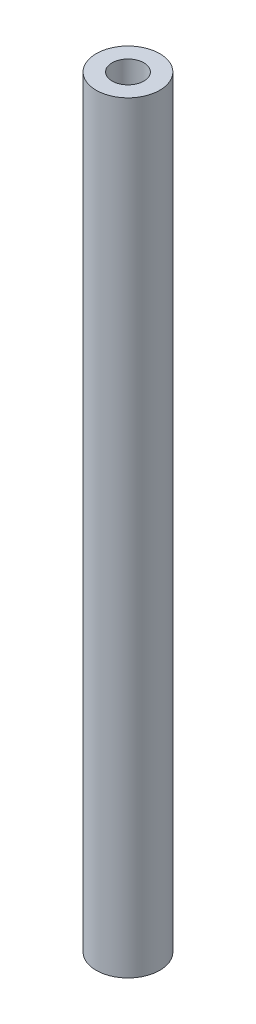
ISO-10303-21;
HEADER;
FILE_DESCRIPTION(('STEP AP214'),'2;1');
FILE_NAME('part.step','',(''),(''),'','','');
FILE_SCHEMA(('AUTOMOTIVE_DESIGN { 1 0 10303 214 1 1 1 1 }'));
ENDSEC;
DATA;
#1=APPLICATION_CONTEXT('core data for automotive mechanical design processes');
#2=APPLICATION_PROTOCOL_DEFINITION('international standard','automotive_design',2000,#1);
#3=PRODUCT_CONTEXT('',#1,'mechanical');
#4=PRODUCT('Part','Part','',(#3));
#5=PRODUCT_RELATED_PRODUCT_CATEGORY('part','',(#4));
#6=PRODUCT_DEFINITION_FORMATION('','',#4);
#7=PRODUCT_DEFINITION_CONTEXT('part definition',#1,'design');
#8=PRODUCT_DEFINITION('design','',#6,#7);
#9=PRODUCT_DEFINITION_SHAPE('','',#8);
#10=(LENGTH_UNIT() NAMED_UNIT(*) SI_UNIT(.MILLI.,.METRE.));
#11=(NAMED_UNIT(*) PLANE_ANGLE_UNIT() SI_UNIT($,.RADIAN.));
#12=(NAMED_UNIT(*) SI_UNIT($,.STERADIAN.) SOLID_ANGLE_UNIT());
#13=UNCERTAINTY_MEASURE_WITH_UNIT(LENGTH_MEASURE(1.E-05),#10,'distance_accuracy_value','');
#14=(GEOMETRIC_REPRESENTATION_CONTEXT(3) GLOBAL_UNCERTAINTY_ASSIGNED_CONTEXT((#13)) GLOBAL_UNIT_ASSIGNED_CONTEXT((#10,
#11,#12)) REPRESENTATION_CONTEXT('',''));
#15=CARTESIAN_POINT('',(0.,0.,0.));
#16=DIRECTION('',(0.,0.,1.));
#17=DIRECTION('',(1.,0.,0.));
#18=AXIS2_PLACEMENT_3D('',#15,#16,#17);
#19=CARTESIAN_POINT('',(0.,60.,0.));
#20=DIRECTION('',(0.,-1.,0.));
#21=DIRECTION('',(0.,0.,-1.));
#22=AXIS2_PLACEMENT_3D('',#19,#20,#21);
#23=CYLINDRICAL_SURFACE('',#22,2.5);
#24=CARTESIAN_POINT('',(0.,60.,0.));
#25=DIRECTION('',(0.,1.,0.));
#26=DIRECTION('',(0.,0.,1.));
#27=AXIS2_PLACEMENT_3D('',#24,#25,#26);
#28=CIRCLE('',#27,2.5);
#29=CARTESIAN_POINT('',(0.,60.,2.5));
#30=VERTEX_POINT('',#29);
#31=EDGE_CURVE('E10',#30,#30,#28,.T.);
#32=ORIENTED_EDGE('',*,*,#31,.F.);
#33=EDGE_LOOP('',(#32));
#34=FACE_BOUND('',#33,.T.);
#35=CARTESIAN_POINT('',(0.,0.,0.));
#36=DIRECTION('',(0.,1.,0.));
#37=DIRECTION('',(0.,0.,1.));
#38=AXIS2_PLACEMENT_3D('',#35,#36,#37);
#39=CIRCLE('',#38,2.5);
#40=CARTESIAN_POINT('',(0.,0.,2.5));
#41=VERTEX_POINT('',#40);
#42=EDGE_CURVE('E33',#41,#41,#39,.T.);
#43=ORIENTED_EDGE('',*,*,#42,.T.);
#44=EDGE_LOOP('',(#43));
#45=FACE_BOUND('',#44,.T.);
#46=ADVANCED_FACE('F30',(#34,#45),#23,.T.);
#47=CARTESIAN_POINT('',(0.,60.,0.));
#48=DIRECTION('',(0.,1.,0.));
#49=DIRECTION('',(0.,0.,1.));
#50=AXIS2_PLACEMENT_3D('',#47,#48,#49);
#51=PLANE('',#50);
#52=CARTESIAN_POINT('',(0.,60.,0.));
#53=DIRECTION('',(0.,1.,0.));
#54=DIRECTION('',(0.,0.,1.));
#55=AXIS2_PLACEMENT_3D('',#52,#53,#54);
#56=CIRCLE('',#55,1.25);
#57=CARTESIAN_POINT('',(0.,60.,1.25));
#58=VERTEX_POINT('',#57);
#59=EDGE_CURVE('E42',#58,#58,#56,.T.);
#60=ORIENTED_EDGE('',*,*,#59,.F.);
#61=EDGE_LOOP('',(#60));
#62=FACE_BOUND('',#61,.T.);
#63=ORIENTED_EDGE('',*,*,#31,.T.);
#64=EDGE_LOOP('',(#63));
#65=FACE_BOUND('',#64,.T.);
#66=ADVANCED_FACE('F57',(#62,#65),#51,.T.);
#67=CARTESIAN_POINT('',(0.,0.,0.));
#68=DIRECTION('',(0.,1.,0.));
#69=DIRECTION('',(0.,0.,1.));
#70=AXIS2_PLACEMENT_3D('',#67,#68,#69);
#71=PLANE('',#70);
#72=CARTESIAN_POINT('',(0.,0.,0.));
#73=DIRECTION('',(0.,1.,0.));
#74=DIRECTION('',(0.,0.,1.));
#75=AXIS2_PLACEMENT_3D('',#72,#73,#74);
#76=CIRCLE('',#75,1.25);
#77=CARTESIAN_POINT('',(0.,0.,1.25));
#78=VERTEX_POINT('',#77);
#79=EDGE_CURVE('E40',#78,#78,#76,.T.);
#80=ORIENTED_EDGE('',*,*,#79,.T.);
#81=EDGE_LOOP('',(#80));
#82=FACE_BOUND('',#81,.T.);
#83=ORIENTED_EDGE('',*,*,#42,.F.);
#84=EDGE_LOOP('',(#83));
#85=FACE_BOUND('',#84,.T.);
#86=ADVANCED_FACE('F48',(#82,#85),#71,.F.);
#87=CARTESIAN_POINT('',(0.,0.,0.));
#88=DIRECTION('',(0.,1.,0.));
#89=DIRECTION('',(0.,0.,1.));
#90=AXIS2_PLACEMENT_3D('',#87,#88,#89);
#91=CYLINDRICAL_SURFACE('',#90,1.25);
#92=ORIENTED_EDGE('',*,*,#79,.F.);
#93=EDGE_LOOP('',(#92));
#94=FACE_BOUND('',#93,.T.);
#95=ORIENTED_EDGE('',*,*,#59,.T.);
#96=EDGE_LOOP('',(#95));
#97=FACE_BOUND('',#96,.T.);
#98=ADVANCED_FACE('F51',(#94,#97),#91,.F.);
#99=CLOSED_SHELL('',(#46,#66,#86,#98));
#100=MANIFOLD_SOLID_BREP('B2',#99);
#101=ADVANCED_BREP_SHAPE_REPRESENTATION('',(#18,#100),#14);
#102=SHAPE_DEFINITION_REPRESENTATION(#9,#101);
ENDSEC;
END-ISO-10303-21;
